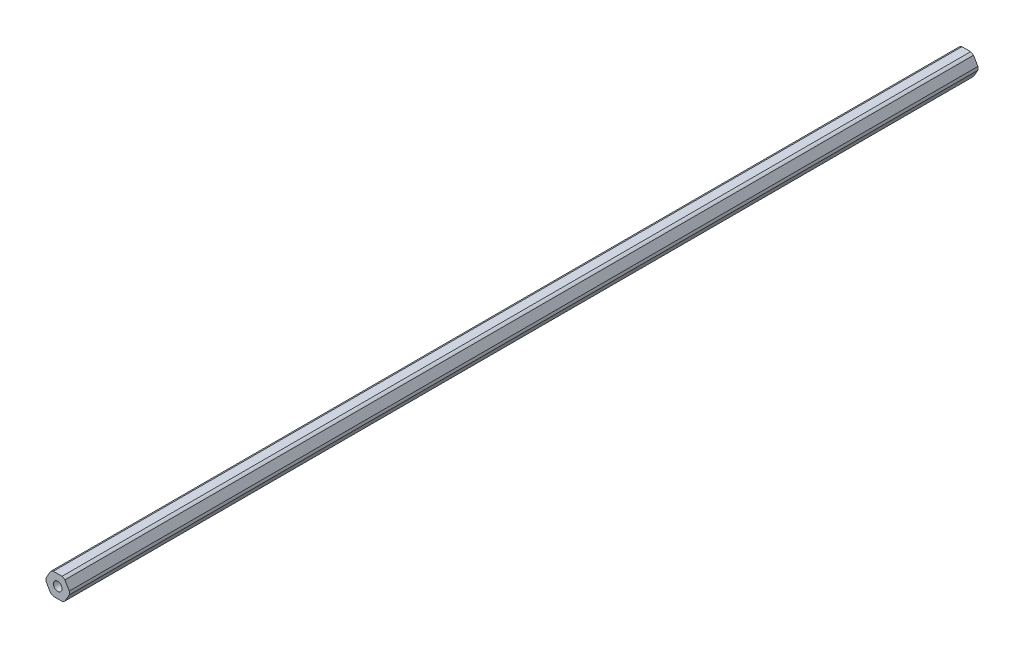
ISO-10303-21;
HEADER;
FILE_DESCRIPTION(('STEP AP214'),'2;1');
FILE_NAME('part.step','',(''),(''),'','','');
FILE_SCHEMA(('AUTOMOTIVE_DESIGN { 1 0 10303 214 1 1 1 1 }'));
ENDSEC;
DATA;
#1=APPLICATION_CONTEXT('core data for automotive mechanical design processes');
#2=APPLICATION_PROTOCOL_DEFINITION('international standard','automotive_design',2000,#1);
#3=PRODUCT_CONTEXT('',#1,'mechanical');
#4=PRODUCT('Part','Part','',(#3));
#5=PRODUCT_RELATED_PRODUCT_CATEGORY('part','',(#4));
#6=PRODUCT_DEFINITION_FORMATION('','',#4);
#7=PRODUCT_DEFINITION_CONTEXT('part definition',#1,'design');
#8=PRODUCT_DEFINITION('design','',#6,#7);
#9=PRODUCT_DEFINITION_SHAPE('','',#8);
#10=(LENGTH_UNIT() NAMED_UNIT(*) SI_UNIT(.MILLI.,.METRE.));
#11=(NAMED_UNIT(*) PLANE_ANGLE_UNIT() SI_UNIT($,.RADIAN.));
#12=(NAMED_UNIT(*) SI_UNIT($,.STERADIAN.) SOLID_ANGLE_UNIT());
#13=UNCERTAINTY_MEASURE_WITH_UNIT(LENGTH_MEASURE(1.E-05),#10,'distance_accuracy_value','');
#14=(GEOMETRIC_REPRESENTATION_CONTEXT(3) GLOBAL_UNCERTAINTY_ASSIGNED_CONTEXT((#13)) GLOBAL_UNIT_ASSIGNED_CONTEXT((#10,
#11,#12)) REPRESENTATION_CONTEXT('',''));
#15=CARTESIAN_POINT('',(0.,0.,0.));
#16=DIRECTION('',(0.,0.,1.));
#17=DIRECTION('',(1.,0.,0.));
#18=AXIS2_PLACEMENT_3D('',#15,#16,#17);
#19=CARTESIAN_POINT('',(0.,0.,-457.2));
#20=DIRECTION('',(0.,0.,1.));
#21=DIRECTION('',(1.,0.,0.));
#22=AXIS2_PLACEMENT_3D('',#19,#20,#21);
#23=CYLINDRICAL_SURFACE('',#22,6.87);
#24=CARTESIAN_POINT('',(0.,0.,-76.2));
#25=DIRECTION('',(0.,0.,1.));
#26=DIRECTION('',(1.,0.,0.));
#27=AXIS2_PLACEMENT_3D('',#24,#25,#26);
#28=CIRCLE('',#27,6.87);
#29=CARTESIAN_POINT('',(6.80102150534208,0.971085209378948,-76.2));
#30=VERTEX_POINT('',#29);
#31=CARTESIAN_POINT('',(6.80102150534208,-0.971085209378953,-76.2));
#32=VERTEX_POINT('',#31);
#33=EDGE_CURVE('E248',#30,#32,#28,.F.);
#34=ORIENTED_EDGE('',*,*,#33,.F.);
#35=DIRECTION('',(0.,0.,1.));
#36=VECTOR('',#35,1.);
#37=CARTESIAN_POINT('',(6.80102150534208,0.97108520937895,457.2));
#38=LINE('',#37,#36);
#39=CARTESIAN_POINT('',(6.80102150534208,0.971085209378948,457.2));
#40=VERTEX_POINT('',#39);
#41=EDGE_CURVE('E139',#30,#40,#38,.T.);
#42=ORIENTED_EDGE('',*,*,#41,.T.);
#43=CARTESIAN_POINT('',(0.,0.,457.2));
#44=DIRECTION('',(0.,0.,1.));
#45=DIRECTION('',(1.,0.,0.));
#46=AXIS2_PLACEMENT_3D('',#43,#44,#45);
#47=CIRCLE('',#46,6.87);
#48=CARTESIAN_POINT('',(6.80102150534208,-0.971085209378954,457.2));
#49=VERTEX_POINT('',#48);
#50=EDGE_CURVE('E58',#40,#49,#47,.F.);
#51=ORIENTED_EDGE('',*,*,#50,.T.);
#52=DIRECTION('',(0.,0.,1.));
#53=VECTOR('',#52,1.);
#54=CARTESIAN_POINT('',(6.80102150534208,-0.971085209378955,457.2));
#55=LINE('',#54,#53);
#56=EDGE_CURVE('E154',#49,#32,#55,.F.);
#57=ORIENTED_EDGE('',*,*,#56,.T.);
#58=EDGE_LOOP('',(#34,#42,#51,#57));
#59=FACE_BOUND('',#58,.T.);
#60=ADVANCED_FACE('F34',(#59),#23,.T.);
#61=CARTESIAN_POINT('',(3.68083890619154,6.3754,457.2));
#62=DIRECTION('',(0.,-1.,0.));
#63=DIRECTION('',(1.,0.,0.));
#64=AXIS2_PLACEMENT_3D('',#61,#62,#63);
#65=PLANE('',#64);
#66=DIRECTION('',(0.,0.,1.));
#67=VECTOR('',#66,1.);
#68=CARTESIAN_POINT('',(2.55952629210953,6.37540000000001,-457.2));
#69=LINE('',#68,#67);
#70=CARTESIAN_POINT('',(2.55952629210953,6.37540000000001,-76.2));
#71=VERTEX_POINT('',#70);
#72=CARTESIAN_POINT('',(2.55952629210953,6.37540000000001,457.2));
#73=VERTEX_POINT('',#72);
#74=EDGE_CURVE('E144',#71,#73,#69,.T.);
#75=ORIENTED_EDGE('',*,*,#74,.F.);
#76=DIRECTION('',(-1.,0.,0.));
#77=VECTOR('',#76,1.);
#78=CARTESIAN_POINT('',(3.68083890619154,6.3754,-76.2));
#79=LINE('',#78,#77);
#80=CARTESIAN_POINT('',(-2.55952629210953,6.3754,-76.2));
#81=VERTEX_POINT('',#80);
#82=EDGE_CURVE('E50',#71,#81,#79,.T.);
#83=ORIENTED_EDGE('',*,*,#82,.T.);
#84=DIRECTION('',(0.,0.,1.));
#85=VECTOR('',#84,1.);
#86=CARTESIAN_POINT('',(-2.55952629210953,6.37540000000001,-457.2));
#87=LINE('',#86,#85);
#88=CARTESIAN_POINT('',(-2.55952629210953,6.37540000000001,457.2));
#89=VERTEX_POINT('',#88);
#90=EDGE_CURVE('E171',#89,#81,#87,.F.);
#91=ORIENTED_EDGE('',*,*,#90,.F.);
#92=DIRECTION('',(1.,0.,0.));
#93=VECTOR('',#92,1.);
#94=CARTESIAN_POINT('',(0.,6.3754,457.2));
#95=LINE('',#94,#93);
#96=EDGE_CURVE('E189',#73,#89,#95,.F.);
#97=ORIENTED_EDGE('',*,*,#96,.F.);
#98=EDGE_LOOP('',(#75,#83,#91,#97));
#99=FACE_BOUND('',#98,.T.);
#100=ADVANCED_FACE('F211',(#99),#65,.F.);
#101=CARTESIAN_POINT('',(0.,0.,-457.2));
#102=DIRECTION('',(0.,0.,1.));
#103=DIRECTION('',(1.,0.,0.));
#104=AXIS2_PLACEMENT_3D('',#101,#102,#103);
#105=CYLINDRICAL_SURFACE('',#104,6.87);
#106=CARTESIAN_POINT('',(0.,0.,-76.2));
#107=DIRECTION('',(0.,0.,1.));
#108=DIRECTION('',(1.,0.,0.));
#109=AXIS2_PLACEMENT_3D('',#106,#107,#108);
#110=CIRCLE('',#109,6.87);
#111=CARTESIAN_POINT('',(-4.24149521323255,5.40431479062104,-76.2));
#112=VERTEX_POINT('',#111);
#113=EDGE_CURVE('E190',#112,#81,#110,.F.);
#114=ORIENTED_EDGE('',*,*,#113,.F.);
#115=DIRECTION('',(0.,0.,1.));
#116=VECTOR('',#115,1.);
#117=CARTESIAN_POINT('',(-4.24149521323255,5.40431479062104,457.2));
#118=LINE('',#117,#116);
#119=CARTESIAN_POINT('',(-4.24149521323255,5.40431479062105,457.2));
#120=VERTEX_POINT('',#119);
#121=EDGE_CURVE('E169',#112,#120,#118,.T.);
#122=ORIENTED_EDGE('',*,*,#121,.T.);
#123=CARTESIAN_POINT('',(0.,0.,457.2));
#124=DIRECTION('',(0.,0.,1.));
#125=DIRECTION('',(1.,0.,0.));
#126=AXIS2_PLACEMENT_3D('',#123,#124,#125);
#127=CIRCLE('',#126,6.87);
#128=EDGE_CURVE('E186',#89,#120,#127,.T.);
#129=ORIENTED_EDGE('',*,*,#128,.F.);
#130=ORIENTED_EDGE('',*,*,#90,.T.);
#131=EDGE_LOOP('',(#114,#122,#129,#130));
#132=FACE_BOUND('',#131,.T.);
#133=ADVANCED_FACE('F213',(#132),#105,.T.);
#134=CARTESIAN_POINT('',(-3.68083890619154,6.3754,457.2));
#135=DIRECTION('',(0.866025403784439,-0.5,0.));
#136=DIRECTION('',(0.5,0.866025403784439,0.));
#137=AXIS2_PLACEMENT_3D('',#134,#135,#136);
#138=PLANE('',#137);
#139=ORIENTED_EDGE('',*,*,#121,.F.);
#140=DIRECTION('',(-0.5,-0.866025403784439,0.));
#141=VECTOR('',#140,1.);
#142=CARTESIAN_POINT('',(-3.68083890619154,6.3754,-76.2));
#143=LINE('',#142,#141);
#144=CARTESIAN_POINT('',(-6.80102150534208,0.971085209378961,-76.2));
#145=VERTEX_POINT('',#144);
#146=EDGE_CURVE('E191',#112,#145,#143,.T.);
#147=ORIENTED_EDGE('',*,*,#146,.T.);
#148=DIRECTION('',(0.,0.,1.));
#149=VECTOR('',#148,1.);
#150=CARTESIAN_POINT('',(-6.80102150534208,0.971085209378959,-457.2));
#151=LINE('',#150,#149);
#152=CARTESIAN_POINT('',(-6.80102150534208,0.971085209378961,457.2));
#153=VERTEX_POINT('',#152);
#154=EDGE_CURVE('E166',#153,#145,#151,.F.);
#155=ORIENTED_EDGE('',*,*,#154,.F.);
#156=DIRECTION('',(-0.5,-0.866025403784439,0.));
#157=VECTOR('',#156,1.);
#158=CARTESIAN_POINT('',(-4.24149521323255,5.40431479062104,457.2));
#159=LINE('',#158,#157);
#160=EDGE_CURVE('E185',#120,#153,#159,.T.);
#161=ORIENTED_EDGE('',*,*,#160,.F.);
#162=EDGE_LOOP('',(#139,#147,#155,#161));
#163=FACE_BOUND('',#162,.T.);
#164=ADVANCED_FACE('F216',(#163),#138,.F.);
#165=CARTESIAN_POINT('',(0.,0.,-457.2));
#166=DIRECTION('',(0.,0.,1.));
#167=DIRECTION('',(1.,0.,0.));
#168=AXIS2_PLACEMENT_3D('',#165,#166,#167);
#169=CYLINDRICAL_SURFACE('',#168,6.87);
#170=CARTESIAN_POINT('',(0.,0.,-76.2));
#171=DIRECTION('',(0.,0.,1.));
#172=DIRECTION('',(1.,0.,0.));
#173=AXIS2_PLACEMENT_3D('',#170,#171,#172);
#174=CIRCLE('',#173,6.87);
#175=CARTESIAN_POINT('',(-6.80102150534208,-0.971085209378955,-76.2));
#176=VERTEX_POINT('',#175);
#177=EDGE_CURVE('E195',#176,#145,#174,.F.);
#178=ORIENTED_EDGE('',*,*,#177,.F.);
#179=DIRECTION('',(0.,0.,1.));
#180=VECTOR('',#179,1.);
#181=CARTESIAN_POINT('',(-6.80102150534208,-0.971085209378956,457.2));
#182=LINE('',#181,#180);
#183=CARTESIAN_POINT('',(-6.80102150534208,-0.971085209378955,457.2));
#184=VERTEX_POINT('',#183);
#185=EDGE_CURVE('E164',#176,#184,#182,.T.);
#186=ORIENTED_EDGE('',*,*,#185,.T.);
#187=CARTESIAN_POINT('',(0.,0.,457.2));
#188=DIRECTION('',(0.,0.,1.));
#189=DIRECTION('',(1.,0.,0.));
#190=AXIS2_PLACEMENT_3D('',#187,#188,#189);
#191=CIRCLE('',#190,6.87);
#192=EDGE_CURVE('E182',#153,#184,#191,.T.);
#193=ORIENTED_EDGE('',*,*,#192,.F.);
#194=ORIENTED_EDGE('',*,*,#154,.T.);
#195=EDGE_LOOP('',(#178,#186,#193,#194));
#196=FACE_BOUND('',#195,.T.);
#197=ADVANCED_FACE('F259',(#196),#169,.T.);
#198=CARTESIAN_POINT('',(-7.36167781238308,0.,457.2));
#199=DIRECTION('',(0.866025403784439,0.5,0.));
#200=DIRECTION('',(-0.5,0.866025403784439,0.));
#201=AXIS2_PLACEMENT_3D('',#198,#199,#200);
#202=PLANE('',#201);
#203=ORIENTED_EDGE('',*,*,#185,.F.);
#204=DIRECTION('',(0.5,-0.866025403784439,0.));
#205=VECTOR('',#204,1.);
#206=CARTESIAN_POINT('',(-7.36167781238308,0.,-76.2));
#207=LINE('',#206,#205);
#208=CARTESIAN_POINT('',(-4.24149521323254,-5.40431479062105,-76.2));
#209=VERTEX_POINT('',#208);
#210=EDGE_CURVE('E227',#176,#209,#207,.T.);
#211=ORIENTED_EDGE('',*,*,#210,.T.);
#212=DIRECTION('',(0.,0.,1.));
#213=VECTOR('',#212,1.);
#214=CARTESIAN_POINT('',(-4.24149521323255,-5.40431479062105,-457.2));
#215=LINE('',#214,#213);
#216=CARTESIAN_POINT('',(-4.24149521323255,-5.40431479062105,457.2));
#217=VERTEX_POINT('',#216);
#218=EDGE_CURVE('E161',#217,#209,#215,.F.);
#219=ORIENTED_EDGE('',*,*,#218,.F.);
#220=DIRECTION('',(0.5,-0.866025403784439,0.));
#221=VECTOR('',#220,1.);
#222=CARTESIAN_POINT('',(-6.80102150534208,-0.971085209378956,457.2));
#223=LINE('',#222,#221);
#224=EDGE_CURVE('E181',#184,#217,#223,.T.);
#225=ORIENTED_EDGE('',*,*,#224,.F.);
#226=EDGE_LOOP('',(#203,#211,#219,#225));
#227=FACE_BOUND('',#226,.T.);
#228=ADVANCED_FACE('F224',(#227),#202,.F.);
#229=CARTESIAN_POINT('',(0.,0.,-457.2));
#230=DIRECTION('',(0.,0.,1.));
#231=DIRECTION('',(1.,0.,0.));
#232=AXIS2_PLACEMENT_3D('',#229,#230,#231);
#233=CYLINDRICAL_SURFACE('',#232,6.87);
#234=CARTESIAN_POINT('',(0.,0.,-76.2));
#235=DIRECTION('',(0.,0.,1.));
#236=DIRECTION('',(1.,0.,0.));
#237=AXIS2_PLACEMENT_3D('',#234,#235,#236);
#238=CIRCLE('',#237,6.87);
#239=CARTESIAN_POINT('',(-2.55952629210953,-6.3754,-76.2));
#240=VERTEX_POINT('',#239);
#241=EDGE_CURVE('E256',#240,#209,#238,.F.);
#242=ORIENTED_EDGE('',*,*,#241,.F.);
#243=DIRECTION('',(0.,0.,1.));
#244=VECTOR('',#243,1.);
#245=CARTESIAN_POINT('',(-2.55952629210953,-6.3754,457.2));
#246=LINE('',#245,#244);
#247=CARTESIAN_POINT('',(-2.55952629210953,-6.3754,457.2));
#248=VERTEX_POINT('',#247);
#249=EDGE_CURVE('E159',#240,#248,#246,.T.);
#250=ORIENTED_EDGE('',*,*,#249,.T.);
#251=CARTESIAN_POINT('',(0.,0.,457.2));
#252=DIRECTION('',(0.,0.,1.));
#253=DIRECTION('',(1.,0.,0.));
#254=AXIS2_PLACEMENT_3D('',#251,#252,#253);
#255=CIRCLE('',#254,6.87);
#256=EDGE_CURVE('E178',#217,#248,#255,.T.);
#257=ORIENTED_EDGE('',*,*,#256,.F.);
#258=ORIENTED_EDGE('',*,*,#218,.T.);
#259=EDGE_LOOP('',(#242,#250,#257,#258));
#260=FACE_BOUND('',#259,.T.);
#261=ADVANCED_FACE('F230',(#260),#233,.T.);
#262=CARTESIAN_POINT('',(-3.68083890619154,-6.3754,457.2));
#263=DIRECTION('',(0.,1.,0.));
#264=DIRECTION('',(0.,0.,1.));
#265=AXIS2_PLACEMENT_3D('',#262,#263,#264);
#266=PLANE('',#265);
#267=ORIENTED_EDGE('',*,*,#249,.F.);
#268=DIRECTION('',(1.,0.,0.));
#269=VECTOR('',#268,1.);
#270=CARTESIAN_POINT('',(-3.68083890619154,-6.3754,-76.2));
#271=LINE('',#270,#269);
#272=CARTESIAN_POINT('',(2.55952629210953,-6.3754,-76.2));
#273=VERTEX_POINT('',#272);
#274=EDGE_CURVE('E238',#240,#273,#271,.T.);
#275=ORIENTED_EDGE('',*,*,#274,.T.);
#276=DIRECTION('',(0.,0.,1.));
#277=VECTOR('',#276,1.);
#278=CARTESIAN_POINT('',(2.55952629210953,-6.3754,-457.2));
#279=LINE('',#278,#277);
#280=CARTESIAN_POINT('',(2.55952629210953,-6.3754,457.2));
#281=VERTEX_POINT('',#280);
#282=EDGE_CURVE('E156',#281,#273,#279,.F.);
#283=ORIENTED_EDGE('',*,*,#282,.F.);
#284=DIRECTION('',(1.,0.,0.));
#285=VECTOR('',#284,1.);
#286=CARTESIAN_POINT('',(0.,-6.3754,457.2));
#287=LINE('',#286,#285);
#288=EDGE_CURVE('E177',#248,#281,#287,.T.);
#289=ORIENTED_EDGE('',*,*,#288,.F.);
#290=EDGE_LOOP('',(#267,#275,#283,#289));
#291=FACE_BOUND('',#290,.T.);
#292=ADVANCED_FACE('F235',(#291),#266,.F.);
#293=CARTESIAN_POINT('',(0.,0.,-457.2));
#294=DIRECTION('',(0.,0.,1.));
#295=DIRECTION('',(1.,0.,0.));
#296=AXIS2_PLACEMENT_3D('',#293,#294,#295);
#297=CYLINDRICAL_SURFACE('',#296,6.87);
#298=CARTESIAN_POINT('',(0.,0.,-76.2));
#299=DIRECTION('',(0.,0.,1.));
#300=DIRECTION('',(1.,0.,0.));
#301=AXIS2_PLACEMENT_3D('',#298,#299,#300);
#302=CIRCLE('',#301,6.87);
#303=CARTESIAN_POINT('',(4.24149521323254,-5.40431479062105,-76.2));
#304=VERTEX_POINT('',#303);
#305=EDGE_CURVE('E250',#304,#273,#302,.F.);
#306=ORIENTED_EDGE('',*,*,#305,.F.);
#307=DIRECTION('',(0.,0.,1.));
#308=VECTOR('',#307,1.);
#309=CARTESIAN_POINT('',(4.24149521323254,-5.40431479062105,457.2));
#310=LINE('',#309,#308);
#311=CARTESIAN_POINT('',(4.24149521323254,-5.40431479062105,457.2));
#312=VERTEX_POINT('',#311);
#313=EDGE_CURVE('E148',#304,#312,#310,.T.);
#314=ORIENTED_EDGE('',*,*,#313,.T.);
#315=CARTESIAN_POINT('',(0.,0.,457.2));
#316=DIRECTION('',(0.,0.,1.));
#317=DIRECTION('',(1.,0.,0.));
#318=AXIS2_PLACEMENT_3D('',#315,#316,#317);
#319=CIRCLE('',#318,6.87);
#320=EDGE_CURVE('E174',#281,#312,#319,.T.);
#321=ORIENTED_EDGE('',*,*,#320,.F.);
#322=ORIENTED_EDGE('',*,*,#282,.T.);
#323=EDGE_LOOP('',(#306,#314,#321,#322));
#324=FACE_BOUND('',#323,.T.);
#325=ADVANCED_FACE('F241',(#324),#297,.T.);
#326=CARTESIAN_POINT('',(3.68083890619154,-6.3754,457.2));
#327=DIRECTION('',(-0.866025403784439,0.5,0.));
#328=DIRECTION('',(-0.5,-0.866025403784439,0.));
#329=AXIS2_PLACEMENT_3D('',#326,#327,#328);
#330=PLANE('',#329);
#331=ORIENTED_EDGE('',*,*,#313,.F.);
#332=DIRECTION('',(0.5,0.866025403784439,0.));
#333=VECTOR('',#332,1.);
#334=CARTESIAN_POINT('',(3.68083890619154,-6.3754,-76.2));
#335=LINE('',#334,#333);
#336=EDGE_CURVE('E247',#304,#32,#335,.T.);
#337=ORIENTED_EDGE('',*,*,#336,.T.);
#338=ORIENTED_EDGE('',*,*,#56,.F.);
#339=DIRECTION('',(0.5,0.866025403784439,0.));
#340=VECTOR('',#339,1.);
#341=CARTESIAN_POINT('',(4.24149521323254,-5.40431479062105,457.2));
#342=LINE('',#341,#340);
#343=EDGE_CURVE('E42',#312,#49,#342,.T.);
#344=ORIENTED_EDGE('',*,*,#343,.F.);
#345=EDGE_LOOP('',(#331,#337,#338,#344));
#346=FACE_BOUND('',#345,.T.);
#347=ADVANCED_FACE('F245',(#346),#330,.F.);
#348=CARTESIAN_POINT('',(7.36167781238308,0.,457.2));
#349=DIRECTION('',(-0.866025403784439,-0.5,0.));
#350=DIRECTION('',(0.5,-0.866025403784439,0.));
#351=AXIS2_PLACEMENT_3D('',#348,#349,#350);
#352=PLANE('',#351);
#353=ORIENTED_EDGE('',*,*,#41,.F.);
#354=DIRECTION('',(-0.5,0.866025403784439,0.));
#355=VECTOR('',#354,1.);
#356=CARTESIAN_POINT('',(7.36167781238308,0.,-76.2));
#357=LINE('',#356,#355);
#358=CARTESIAN_POINT('',(4.24149521323254,5.40431479062105,-76.2));
#359=VERTEX_POINT('',#358);
#360=EDGE_CURVE('E126',#30,#359,#357,.T.);
#361=ORIENTED_EDGE('',*,*,#360,.T.);
#362=DIRECTION('',(0.,0.,1.));
#363=VECTOR('',#362,1.);
#364=CARTESIAN_POINT('',(4.24149521323254,5.40431479062105,-457.2));
#365=LINE('',#364,#363);
#366=CARTESIAN_POINT('',(4.24149521323254,5.40431479062105,457.2));
#367=VERTEX_POINT('',#366);
#368=EDGE_CURVE('E137',#367,#359,#365,.F.);
#369=ORIENTED_EDGE('',*,*,#368,.F.);
#370=DIRECTION('',(-0.5,0.866025403784438,0.));
#371=VECTOR('',#370,1.);
#372=CARTESIAN_POINT('',(6.80102150534208,0.97108520937895,457.2));
#373=LINE('',#372,#371);
#374=EDGE_CURVE('E146',#40,#367,#373,.T.);
#375=ORIENTED_EDGE('',*,*,#374,.F.);
#376=EDGE_LOOP('',(#353,#361,#369,#375));
#377=FACE_BOUND('',#376,.T.);
#378=ADVANCED_FACE('F135',(#377),#352,.F.);
#379=CARTESIAN_POINT('',(0.,0.,-457.2));
#380=DIRECTION('',(0.,0.,1.));
#381=DIRECTION('',(1.,0.,0.));
#382=AXIS2_PLACEMENT_3D('',#379,#380,#381);
#383=CYLINDRICAL_SURFACE('',#382,6.87);
#384=CARTESIAN_POINT('',(0.,0.,-76.2));
#385=DIRECTION('',(0.,0.,1.));
#386=DIRECTION('',(1.,0.,0.));
#387=AXIS2_PLACEMENT_3D('',#384,#385,#386);
#388=CIRCLE('',#387,6.87);
#389=EDGE_CURVE('E122',#71,#359,#388,.F.);
#390=ORIENTED_EDGE('',*,*,#389,.F.);
#391=ORIENTED_EDGE('',*,*,#74,.T.);
#392=CARTESIAN_POINT('',(0.,0.,457.2));
#393=DIRECTION('',(0.,0.,1.));
#394=DIRECTION('',(1.,0.,0.));
#395=AXIS2_PLACEMENT_3D('',#392,#393,#394);
#396=CIRCLE('',#395,6.87);
#397=EDGE_CURVE('E143',#367,#73,#396,.T.);
#398=ORIENTED_EDGE('',*,*,#397,.F.);
#399=ORIENTED_EDGE('',*,*,#368,.T.);
#400=EDGE_LOOP('',(#390,#391,#398,#399));
#401=FACE_BOUND('',#400,.T.);
#402=ADVANCED_FACE('F141',(#401),#383,.T.);
#403=CARTESIAN_POINT('',(0.,0.,457.2));
#404=DIRECTION('',(0.,0.,1.));
#405=DIRECTION('',(1.,0.,0.));
#406=AXIS2_PLACEMENT_3D('',#403,#404,#405);
#407=PLANE('',#406);
#408=ORIENTED_EDGE('',*,*,#343,.T.);
#409=ORIENTED_EDGE('',*,*,#50,.F.);
#410=ORIENTED_EDGE('',*,*,#374,.T.);
#411=ORIENTED_EDGE('',*,*,#397,.T.);
#412=ORIENTED_EDGE('',*,*,#96,.T.);
#413=ORIENTED_EDGE('',*,*,#128,.T.);
#414=ORIENTED_EDGE('',*,*,#160,.T.);
#415=ORIENTED_EDGE('',*,*,#192,.T.);
#416=ORIENTED_EDGE('',*,*,#224,.T.);
#417=ORIENTED_EDGE('',*,*,#256,.T.);
#418=ORIENTED_EDGE('',*,*,#288,.T.);
#419=ORIENTED_EDGE('',*,*,#320,.T.);
#420=EDGE_LOOP('',(#408,#409,#410,#411,#412,#413,#414,#415,#416,#417,#418,#419));
#421=FACE_BOUND('',#420,.T.);
#422=CARTESIAN_POINT('',(0.,0.,457.2));
#423=DIRECTION('',(0.,0.,1.));
#424=DIRECTION('',(1.,0.,0.));
#425=AXIS2_PLACEMENT_3D('',#422,#423,#424);
#426=CIRCLE('',#425,2.55);
#427=CARTESIAN_POINT('',(2.55,0.,457.2));
#428=VERTEX_POINT('',#427);
#429=EDGE_CURVE('E11',#428,#428,#426,.F.);
#430=ORIENTED_EDGE('',*,*,#429,.T.);
#431=EDGE_LOOP('',(#430));
#432=FACE_BOUND('',#431,.T.);
#433=ADVANCED_FACE('F206',(#421,#432),#407,.T.);
#434=CARTESIAN_POINT('',(0.,0.,-457.2));
#435=DIRECTION('',(0.,0.,1.));
#436=DIRECTION('',(1.,0.,0.));
#437=AXIS2_PLACEMENT_3D('',#434,#435,#436);
#438=CYLINDRICAL_SURFACE('',#437,2.55);
#439=CARTESIAN_POINT('',(0.,0.,-76.2));
#440=DIRECTION('',(0.,0.,1.));
#441=DIRECTION('',(1.,0.,0.));
#442=AXIS2_PLACEMENT_3D('',#439,#440,#441);
#443=CIRCLE('',#442,2.55);
#444=CARTESIAN_POINT('',(2.55,0.,-76.2));
#445=VERTEX_POINT('',#444);
#446=EDGE_CURVE('E37',#445,#445,#443,.F.);
#447=ORIENTED_EDGE('',*,*,#446,.T.);
#448=EDGE_LOOP('',(#447));
#449=FACE_BOUND('',#448,.T.);
#450=ORIENTED_EDGE('',*,*,#429,.F.);
#451=EDGE_LOOP('',(#450));
#452=FACE_BOUND('',#451,.T.);
#453=ADVANCED_FACE('F268',(#449,#452),#438,.F.);
#454=CARTESIAN_POINT('',(0.,0.,-76.2));
#455=DIRECTION('',(0.,0.,1.));
#456=DIRECTION('',(1.,0.,0.));
#457=AXIS2_PLACEMENT_3D('',#454,#455,#456);
#458=PLANE('',#457);
#459=ORIENTED_EDGE('',*,*,#113,.T.);
#460=ORIENTED_EDGE('',*,*,#82,.F.);
#461=ORIENTED_EDGE('',*,*,#389,.T.);
#462=ORIENTED_EDGE('',*,*,#360,.F.);
#463=ORIENTED_EDGE('',*,*,#33,.T.);
#464=ORIENTED_EDGE('',*,*,#336,.F.);
#465=ORIENTED_EDGE('',*,*,#305,.T.);
#466=ORIENTED_EDGE('',*,*,#274,.F.);
#467=ORIENTED_EDGE('',*,*,#241,.T.);
#468=ORIENTED_EDGE('',*,*,#210,.F.);
#469=ORIENTED_EDGE('',*,*,#177,.T.);
#470=ORIENTED_EDGE('',*,*,#146,.F.);
#471=EDGE_LOOP('',(#459,#460,#461,#462,#463,#464,#465,#466,#467,#468,#469,#470));
#472=FACE_BOUND('',#471,.T.);
#473=ORIENTED_EDGE('',*,*,#446,.F.);
#474=EDGE_LOOP('',(#473));
#475=FACE_BOUND('',#474,.T.);
#476=ADVANCED_FACE('F124',(#472,#475),#458,.F.);
#477=CLOSED_SHELL('',(#60,#100,#133,#164,#197,#228,#261,#292,#325,#347,#378,#402,#433,#453,#476));
#478=MANIFOLD_SOLID_BREP('B2',#477);
#479=ADVANCED_BREP_SHAPE_REPRESENTATION('',(#18,#478),#14);
#480=SHAPE_DEFINITION_REPRESENTATION(#9,#479);
ENDSEC;
END-ISO-10303-21;
